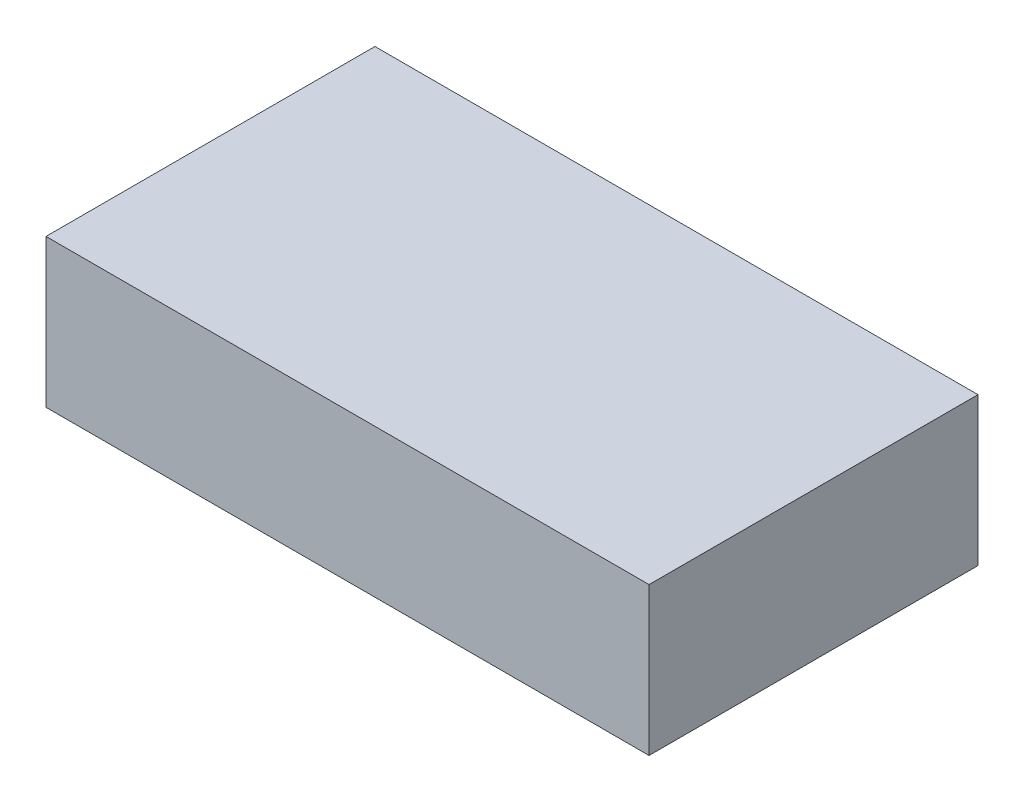
ISO-10303-21;
HEADER;
FILE_DESCRIPTION(('STEP AP214'),'2;1');
FILE_NAME('part.step','',(''),(''),'','','');
FILE_SCHEMA(('AUTOMOTIVE_DESIGN { 1 0 10303 214 1 1 1 1 }'));
ENDSEC;
DATA;
#1=APPLICATION_CONTEXT('core data for automotive mechanical design processes');
#2=APPLICATION_PROTOCOL_DEFINITION('international standard','automotive_design',2000,#1);
#3=PRODUCT_CONTEXT('',#1,'mechanical');
#4=PRODUCT('Part','Part','',(#3));
#5=PRODUCT_RELATED_PRODUCT_CATEGORY('part','',(#4));
#6=PRODUCT_DEFINITION_FORMATION('','',#4);
#7=PRODUCT_DEFINITION_CONTEXT('part definition',#1,'design');
#8=PRODUCT_DEFINITION('design','',#6,#7);
#9=PRODUCT_DEFINITION_SHAPE('','',#8);
#10=(LENGTH_UNIT() NAMED_UNIT(*) SI_UNIT(.MILLI.,.METRE.));
#11=(NAMED_UNIT(*) PLANE_ANGLE_UNIT() SI_UNIT($,.RADIAN.));
#12=(NAMED_UNIT(*) SI_UNIT($,.STERADIAN.) SOLID_ANGLE_UNIT());
#13=UNCERTAINTY_MEASURE_WITH_UNIT(LENGTH_MEASURE(1.E-05),#10,'distance_accuracy_value','');
#14=(GEOMETRIC_REPRESENTATION_CONTEXT(3) GLOBAL_UNCERTAINTY_ASSIGNED_CONTEXT((#13)) GLOBAL_UNIT_ASSIGNED_CONTEXT((#10,
#11,#12)) REPRESENTATION_CONTEXT('',''));
#15=CARTESIAN_POINT('',(0.,0.,0.));
#16=DIRECTION('',(0.,0.,1.));
#17=DIRECTION('',(1.,0.,0.));
#18=AXIS2_PLACEMENT_3D('',#15,#16,#17);
#19=CARTESIAN_POINT('',(0.,54.,0.));
#20=DIRECTION('',(1.,0.,0.));
#21=DIRECTION('',(0.,0.,-1.));
#22=AXIS2_PLACEMENT_3D('',#19,#20,#21);
#23=PLANE('',#22);
#24=DIRECTION('',(0.,0.,1.));
#25=VECTOR('',#24,1.);
#26=CARTESIAN_POINT('',(0.,0.,0.));
#27=LINE('',#26,#25);
#28=CARTESIAN_POINT('',(0.,0.,-120.));
#29=VERTEX_POINT('',#28);
#30=CARTESIAN_POINT('',(0.,0.,0.));
#31=VERTEX_POINT('',#30);
#32=EDGE_CURVE('E107',#29,#31,#27,.T.);
#33=ORIENTED_EDGE('',*,*,#32,.T.);
#34=DIRECTION('',(0.,-1.,0.));
#35=VECTOR('',#34,1.);
#36=CARTESIAN_POINT('',(0.,54.,0.));
#37=LINE('',#36,#35);
#38=CARTESIAN_POINT('',(0.,54.,0.));
#39=VERTEX_POINT('',#38);
#40=EDGE_CURVE('E11',#39,#31,#37,.T.);
#41=ORIENTED_EDGE('',*,*,#40,.F.);
#42=DIRECTION('',(0.,0.,1.));
#43=VECTOR('',#42,1.);
#44=CARTESIAN_POINT('',(0.,54.,0.));
#45=LINE('',#44,#43);
#46=CARTESIAN_POINT('',(0.,54.,-120.));
#47=VERTEX_POINT('',#46);
#48=EDGE_CURVE('E91',#47,#39,#45,.T.);
#49=ORIENTED_EDGE('',*,*,#48,.F.);
#50=DIRECTION('',(0.,-1.,0.));
#51=VECTOR('',#50,1.);
#52=CARTESIAN_POINT('',(0.,54.,-120.));
#53=LINE('',#52,#51);
#54=EDGE_CURVE('E103',#47,#29,#53,.T.);
#55=ORIENTED_EDGE('',*,*,#54,.T.);
#56=EDGE_LOOP('',(#33,#41,#49,#55));
#57=FACE_BOUND('',#56,.T.);
#58=ADVANCED_FACE('F39',(#57),#23,.F.);
#59=CARTESIAN_POINT('',(0.,54.,0.));
#60=DIRECTION('',(0.,0.,-1.));
#61=DIRECTION('',(-1.,0.,0.));
#62=AXIS2_PLACEMENT_3D('',#59,#60,#61);
#63=PLANE('',#62);
#64=DIRECTION('',(1.,0.,0.));
#65=VECTOR('',#64,1.);
#66=CARTESIAN_POINT('',(0.,0.,0.));
#67=LINE('',#66,#65);
#68=CARTESIAN_POINT('',(220.,0.,0.));
#69=VERTEX_POINT('',#68);
#70=EDGE_CURVE('E96',#31,#69,#67,.T.);
#71=ORIENTED_EDGE('',*,*,#70,.T.);
#72=DIRECTION('',(0.,-1.,0.));
#73=VECTOR('',#72,1.);
#74=CARTESIAN_POINT('',(220.,54.,0.));
#75=LINE('',#74,#73);
#76=CARTESIAN_POINT('',(220.,54.,0.));
#77=VERTEX_POINT('',#76);
#78=EDGE_CURVE('E48',#77,#69,#75,.T.);
#79=ORIENTED_EDGE('',*,*,#78,.F.);
#80=DIRECTION('',(1.,0.,0.));
#81=VECTOR('',#80,1.);
#82=CARTESIAN_POINT('',(0.,54.,0.));
#83=LINE('',#82,#81);
#84=EDGE_CURVE('E86',#39,#77,#83,.T.);
#85=ORIENTED_EDGE('',*,*,#84,.F.);
#86=ORIENTED_EDGE('',*,*,#40,.T.);
#87=EDGE_LOOP('',(#71,#79,#85,#86));
#88=FACE_BOUND('',#87,.T.);
#89=ADVANCED_FACE('F95',(#88),#63,.F.);
#90=CARTESIAN_POINT('',(220.,54.,0.));
#91=DIRECTION('',(-1.,0.,0.));
#92=DIRECTION('',(0.,0.,1.));
#93=AXIS2_PLACEMENT_3D('',#90,#91,#92);
#94=PLANE('',#93);
#95=DIRECTION('',(0.,0.,-1.));
#96=VECTOR('',#95,1.);
#97=CARTESIAN_POINT('',(220.,0.,0.));
#98=LINE('',#97,#96);
#99=CARTESIAN_POINT('',(220.,0.,-120.));
#100=VERTEX_POINT('',#99);
#101=EDGE_CURVE('E73',#69,#100,#98,.T.);
#102=ORIENTED_EDGE('',*,*,#101,.T.);
#103=DIRECTION('',(0.,-1.,0.));
#104=VECTOR('',#103,1.);
#105=CARTESIAN_POINT('',(220.,54.,-120.));
#106=LINE('',#105,#104);
#107=CARTESIAN_POINT('',(220.,54.,-120.));
#108=VERTEX_POINT('',#107);
#109=EDGE_CURVE('E98',#108,#100,#106,.T.);
#110=ORIENTED_EDGE('',*,*,#109,.F.);
#111=DIRECTION('',(0.,0.,-1.));
#112=VECTOR('',#111,1.);
#113=CARTESIAN_POINT('',(220.,54.,0.));
#114=LINE('',#113,#112);
#115=EDGE_CURVE('E89',#77,#108,#114,.T.);
#116=ORIENTED_EDGE('',*,*,#115,.F.);
#117=ORIENTED_EDGE('',*,*,#78,.T.);
#118=EDGE_LOOP('',(#102,#110,#116,#117));
#119=FACE_BOUND('',#118,.T.);
#120=ADVANCED_FACE('F99',(#119),#94,.F.);
#121=CARTESIAN_POINT('',(0.,54.,-120.));
#122=DIRECTION('',(0.,0.,1.));
#123=DIRECTION('',(1.,0.,0.));
#124=AXIS2_PLACEMENT_3D('',#121,#122,#123);
#125=PLANE('',#124);
#126=DIRECTION('',(-1.,0.,0.));
#127=VECTOR('',#126,1.);
#128=CARTESIAN_POINT('',(0.,0.,-120.));
#129=LINE('',#128,#127);
#130=EDGE_CURVE('E79',#100,#29,#129,.T.);
#131=ORIENTED_EDGE('',*,*,#130,.T.);
#132=ORIENTED_EDGE('',*,*,#54,.F.);
#133=DIRECTION('',(-1.,0.,0.));
#134=VECTOR('',#133,1.);
#135=CARTESIAN_POINT('',(0.,54.,-120.));
#136=LINE('',#135,#134);
#137=EDGE_CURVE('E56',#108,#47,#136,.T.);
#138=ORIENTED_EDGE('',*,*,#137,.F.);
#139=ORIENTED_EDGE('',*,*,#109,.T.);
#140=EDGE_LOOP('',(#131,#132,#138,#139));
#141=FACE_BOUND('',#140,.T.);
#142=ADVANCED_FACE('F120',(#141),#125,.F.);
#143=CARTESIAN_POINT('',(0.,54.,0.));
#144=DIRECTION('',(0.,-1.,0.));
#145=DIRECTION('',(0.,0.,-1.));
#146=AXIS2_PLACEMENT_3D('',#143,#144,#145);
#147=PLANE('',#146);
#148=ORIENTED_EDGE('',*,*,#48,.T.);
#149=ORIENTED_EDGE('',*,*,#84,.T.);
#150=ORIENTED_EDGE('',*,*,#115,.T.);
#151=ORIENTED_EDGE('',*,*,#137,.T.);
#152=EDGE_LOOP('',(#148,#149,#150,#151));
#153=FACE_BOUND('',#152,.T.);
#154=ADVANCED_FACE('F87',(#153),#147,.F.);
#155=CARTESIAN_POINT('',(0.,0.,0.));
#156=DIRECTION('',(0.,-1.,0.));
#157=DIRECTION('',(0.,0.,-1.));
#158=AXIS2_PLACEMENT_3D('',#155,#156,#157);
#159=PLANE('',#158);
#160=ORIENTED_EDGE('',*,*,#32,.F.);
#161=ORIENTED_EDGE('',*,*,#130,.F.);
#162=ORIENTED_EDGE('',*,*,#101,.F.);
#163=ORIENTED_EDGE('',*,*,#70,.F.);
#164=EDGE_LOOP('',(#160,#161,#162,#163));
#165=FACE_BOUND('',#164,.T.);
#166=ADVANCED_FACE('F123',(#165),#159,.T.);
#167=CLOSED_SHELL('',(#58,#89,#120,#142,#154,#166));
#168=MANIFOLD_SOLID_BREP('B2',#167);
#169=ADVANCED_BREP_SHAPE_REPRESENTATION('',(#18,#168),#14);
#170=SHAPE_DEFINITION_REPRESENTATION(#9,#169);
ENDSEC;
END-ISO-10303-21;
